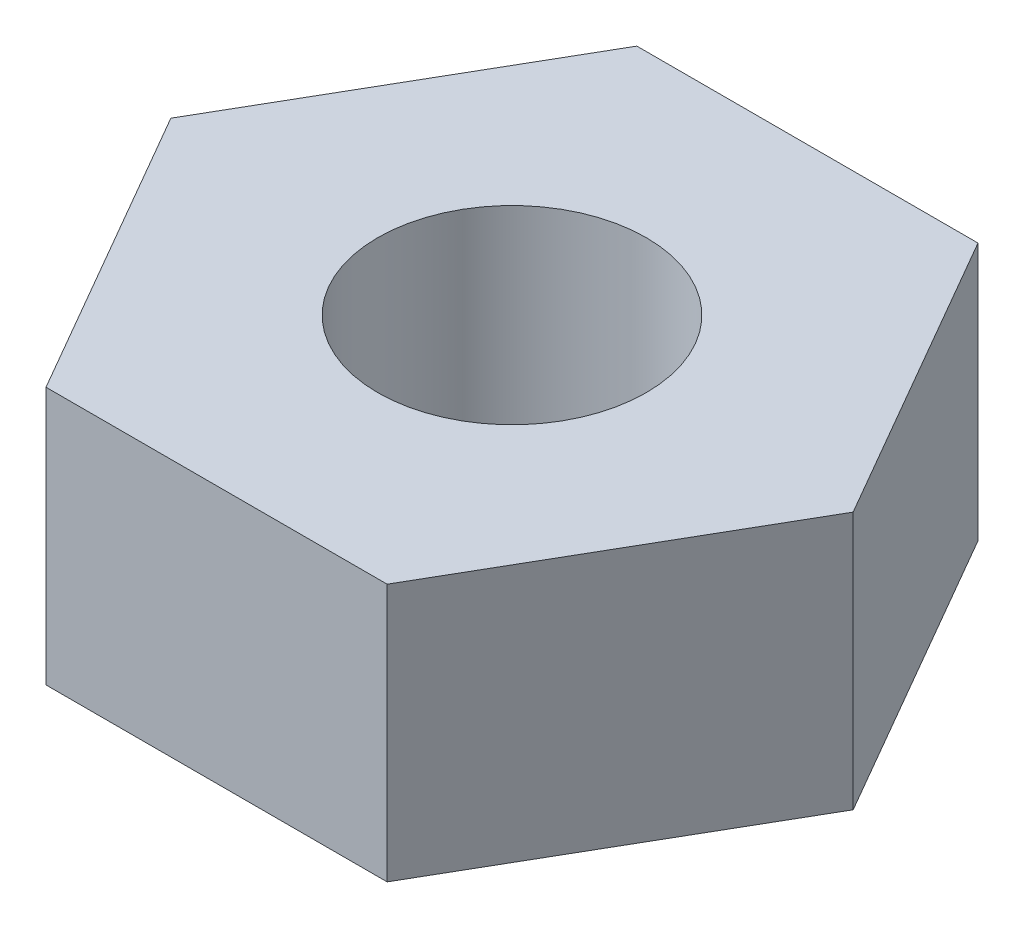
ISO-10303-21;
HEADER;
FILE_DESCRIPTION(('STEP AP214'),'2;1');
FILE_NAME('part.step','',(''),(''),'','','');
FILE_SCHEMA(('AUTOMOTIVE_DESIGN { 1 0 10303 214 1 1 1 1 }'));
ENDSEC;
DATA;
#1=APPLICATION_CONTEXT('core data for automotive mechanical design processes');
#2=APPLICATION_PROTOCOL_DEFINITION('international standard','automotive_design',2000,#1);
#3=PRODUCT_CONTEXT('',#1,'mechanical');
#4=PRODUCT('Part','Part','',(#3));
#5=PRODUCT_RELATED_PRODUCT_CATEGORY('part','',(#4));
#6=PRODUCT_DEFINITION_FORMATION('','',#4);
#7=PRODUCT_DEFINITION_CONTEXT('part definition',#1,'design');
#8=PRODUCT_DEFINITION('design','',#6,#7);
#9=PRODUCT_DEFINITION_SHAPE('','',#8);
#10=(LENGTH_UNIT() NAMED_UNIT(*) SI_UNIT(.MILLI.,.METRE.));
#11=(NAMED_UNIT(*) PLANE_ANGLE_UNIT() SI_UNIT($,.RADIAN.));
#12=(NAMED_UNIT(*) SI_UNIT($,.STERADIAN.) SOLID_ANGLE_UNIT());
#13=UNCERTAINTY_MEASURE_WITH_UNIT(LENGTH_MEASURE(1.E-05),#10,'distance_accuracy_value','');
#14=(GEOMETRIC_REPRESENTATION_CONTEXT(3) GLOBAL_UNCERTAINTY_ASSIGNED_CONTEXT((#13)) GLOBAL_UNIT_ASSIGNED_CONTEXT((#10,
#11,#12)) REPRESENTATION_CONTEXT('',''));
#15=CARTESIAN_POINT('',(0.,0.,0.));
#16=DIRECTION('',(0.,0.,1.));
#17=DIRECTION('',(1.,0.,0.));
#18=AXIS2_PLACEMENT_3D('',#15,#16,#17);
#19=CARTESIAN_POINT('',(-1.5877132402715,2.4,-2.74999999999998));
#20=DIRECTION('',(0.866025403784441,0.,0.499999999999995));
#21=DIRECTION('',(0.499999999999995,0.,-0.866025403784442));
#22=AXIS2_PLACEMENT_3D('',#19,#20,#21);
#23=PLANE('',#22);
#24=DIRECTION('',(-0.499999999999995,0.,0.866025403784442));
#25=VECTOR('',#24,1.);
#26=CARTESIAN_POINT('',(-1.5877132402715,0.,-2.74999999999998));
#27=LINE('',#26,#25);
#28=CARTESIAN_POINT('',(-1.5877132402715,0.,-2.74999999999998));
#29=VERTEX_POINT('',#28);
#30=CARTESIAN_POINT('',(-3.17542648054294,0.,0.));
#31=VERTEX_POINT('',#30);
#32=EDGE_CURVE('E122',#29,#31,#27,.T.);
#33=ORIENTED_EDGE('',*,*,#32,.T.);
#34=DIRECTION('',(0.,-1.,0.));
#35=VECTOR('',#34,1.);
#36=CARTESIAN_POINT('',(-3.17542648054294,2.4,0.));
#37=LINE('',#36,#35);
#38=CARTESIAN_POINT('',(-3.17542648054294,2.4,0.));
#39=VERTEX_POINT('',#38);
#40=EDGE_CURVE('E11',#39,#31,#37,.T.);
#41=ORIENTED_EDGE('',*,*,#40,.F.);
#42=DIRECTION('',(-0.499999999999995,0.,0.866025403784442));
#43=VECTOR('',#42,1.);
#44=CARTESIAN_POINT('',(-1.5877132402715,2.4,-2.74999999999998));
#45=LINE('',#44,#43);
#46=CARTESIAN_POINT('',(-1.5877132402715,2.4,-2.74999999999998));
#47=VERTEX_POINT('',#46);
#48=EDGE_CURVE('E133',#47,#39,#45,.T.);
#49=ORIENTED_EDGE('',*,*,#48,.F.);
#50=DIRECTION('',(0.,-1.,0.));
#51=VECTOR('',#50,1.);
#52=CARTESIAN_POINT('',(-1.5877132402715,2.4,-2.74999999999998));
#53=LINE('',#52,#51);
#54=EDGE_CURVE('E118',#47,#29,#53,.T.);
#55=ORIENTED_EDGE('',*,*,#54,.T.);
#56=EDGE_LOOP('',(#33,#41,#49,#55));
#57=FACE_BOUND('',#56,.T.);
#58=ADVANCED_FACE('F38',(#57),#23,.F.);
#59=CARTESIAN_POINT('',(-3.17542648054294,2.4,0.));
#60=DIRECTION('',(0.866025403784438,0.,-0.500000000000001));
#61=DIRECTION('',(-0.500000000000001,0.,-0.866025403784438));
#62=AXIS2_PLACEMENT_3D('',#59,#60,#61);
#63=PLANE('',#62);
#64=DIRECTION('',(0.500000000000001,0.,0.866025403784438));
#65=VECTOR('',#64,1.);
#66=CARTESIAN_POINT('',(-3.17542648054294,0.,0.));
#67=LINE('',#66,#65);
#68=CARTESIAN_POINT('',(-1.58771324027146,0.,2.75));
#69=VERTEX_POINT('',#68);
#70=EDGE_CURVE('E125',#31,#69,#67,.T.);
#71=ORIENTED_EDGE('',*,*,#70,.T.);
#72=DIRECTION('',(0.,-1.,0.));
#73=VECTOR('',#72,1.);
#74=CARTESIAN_POINT('',(-1.58771324027146,2.4,2.75));
#75=LINE('',#74,#73);
#76=CARTESIAN_POINT('',(-1.58771324027146,2.4,2.75));
#77=VERTEX_POINT('',#76);
#78=EDGE_CURVE('E46',#77,#69,#75,.T.);
#79=ORIENTED_EDGE('',*,*,#78,.F.);
#80=DIRECTION('',(0.500000000000001,0.,0.866025403784438));
#81=VECTOR('',#80,1.);
#82=CARTESIAN_POINT('',(-3.17542648054294,2.4,0.));
#83=LINE('',#82,#81);
#84=EDGE_CURVE('E91',#39,#77,#83,.T.);
#85=ORIENTED_EDGE('',*,*,#84,.F.);
#86=ORIENTED_EDGE('',*,*,#40,.T.);
#87=EDGE_LOOP('',(#71,#79,#85,#86));
#88=FACE_BOUND('',#87,.T.);
#89=ADVANCED_FACE('F158',(#88),#63,.F.);
#90=CARTESIAN_POINT('',(-1.58771324027146,2.4,2.75));
#91=DIRECTION('',(0.,0.,-1.));
#92=DIRECTION('',(-1.,0.,0.));
#93=AXIS2_PLACEMENT_3D('',#90,#91,#92);
#94=PLANE('',#93);
#95=DIRECTION('',(1.,0.,0.));
#96=VECTOR('',#95,1.);
#97=CARTESIAN_POINT('',(-1.58771324027146,0.,2.75));
#98=LINE('',#97,#96);
#99=CARTESIAN_POINT('',(1.58771324027148,0.,2.74999999999999));
#100=VERTEX_POINT('',#99);
#101=EDGE_CURVE('E128',#69,#100,#98,.T.);
#102=ORIENTED_EDGE('',*,*,#101,.T.);
#103=DIRECTION('',(0.,-1.,0.));
#104=VECTOR('',#103,1.);
#105=CARTESIAN_POINT('',(1.58771324027148,2.4,2.74999999999999));
#106=LINE('',#105,#104);
#107=CARTESIAN_POINT('',(1.58771324027148,2.4,2.74999999999999));
#108=VERTEX_POINT('',#107);
#109=EDGE_CURVE('E113',#108,#100,#106,.T.);
#110=ORIENTED_EDGE('',*,*,#109,.F.);
#111=DIRECTION('',(1.,0.,0.));
#112=VECTOR('',#111,1.);
#113=CARTESIAN_POINT('',(-1.58771324027146,2.4,2.75));
#114=LINE('',#113,#112);
#115=EDGE_CURVE('E104',#77,#108,#114,.T.);
#116=ORIENTED_EDGE('',*,*,#115,.F.);
#117=ORIENTED_EDGE('',*,*,#78,.T.);
#118=EDGE_LOOP('',(#102,#110,#116,#117));
#119=FACE_BOUND('',#118,.T.);
#120=ADVANCED_FACE('F139',(#119),#94,.F.);
#121=CARTESIAN_POINT('',(1.58771324027148,2.4,2.74999999999999));
#122=DIRECTION('',(-0.866025403784441,0.,-0.499999999999995));
#123=DIRECTION('',(-0.499999999999995,0.,0.866025403784442));
#124=AXIS2_PLACEMENT_3D('',#121,#122,#123);
#125=PLANE('',#124);
#126=DIRECTION('',(0.499999999999995,0.,-0.866025403784442));
#127=VECTOR('',#126,1.);
#128=CARTESIAN_POINT('',(1.58771324027148,0.,2.74999999999999));
#129=LINE('',#128,#127);
#130=CARTESIAN_POINT('',(3.17542648054294,0.,0.));
#131=VERTEX_POINT('',#130);
#132=EDGE_CURVE('E112',#100,#131,#129,.T.);
#133=ORIENTED_EDGE('',*,*,#132,.T.);
#134=DIRECTION('',(0.,-1.,0.));
#135=VECTOR('',#134,1.);
#136=CARTESIAN_POINT('',(3.17542648054294,2.4,0.));
#137=LINE('',#136,#135);
#138=CARTESIAN_POINT('',(3.17542648054294,2.4,0.));
#139=VERTEX_POINT('',#138);
#140=EDGE_CURVE('E109',#139,#131,#137,.T.);
#141=ORIENTED_EDGE('',*,*,#140,.F.);
#142=DIRECTION('',(0.499999999999995,0.,-0.866025403784442));
#143=VECTOR('',#142,1.);
#144=CARTESIAN_POINT('',(1.58771324027148,2.4,2.74999999999999));
#145=LINE('',#144,#143);
#146=EDGE_CURVE('E98',#108,#139,#145,.T.);
#147=ORIENTED_EDGE('',*,*,#146,.F.);
#148=ORIENTED_EDGE('',*,*,#109,.T.);
#149=EDGE_LOOP('',(#133,#141,#147,#148));
#150=FACE_BOUND('',#149,.T.);
#151=ADVANCED_FACE('F110',(#150),#125,.F.);
#152=CARTESIAN_POINT('',(3.17542648054294,2.4,0.));
#153=DIRECTION('',(-0.866025403784435,0.,0.500000000000007));
#154=DIRECTION('',(0.500000000000007,0.,0.866025403784435));
#155=AXIS2_PLACEMENT_3D('',#152,#153,#154);
#156=PLANE('',#155);
#157=DIRECTION('',(-0.500000000000007,0.,-0.866025403784435));
#158=VECTOR('',#157,1.);
#159=CARTESIAN_POINT('',(3.17542648054294,0.,0.));
#160=LINE('',#159,#158);
#161=CARTESIAN_POINT('',(1.58771324027145,0.,-2.75000000000001));
#162=VERTEX_POINT('',#161);
#163=EDGE_CURVE('E77',#131,#162,#160,.T.);
#164=ORIENTED_EDGE('',*,*,#163,.T.);
#165=DIRECTION('',(0.,-1.,0.));
#166=VECTOR('',#165,1.);
#167=CARTESIAN_POINT('',(1.58771324027145,2.4,-2.75000000000001));
#168=LINE('',#167,#166);
#169=CARTESIAN_POINT('',(1.58771324027145,2.4,-2.75000000000001));
#170=VERTEX_POINT('',#169);
#171=EDGE_CURVE('E114',#170,#162,#168,.T.);
#172=ORIENTED_EDGE('',*,*,#171,.F.);
#173=DIRECTION('',(-0.500000000000007,0.,-0.866025403784435));
#174=VECTOR('',#173,1.);
#175=CARTESIAN_POINT('',(3.17542648054294,2.4,0.));
#176=LINE('',#175,#174);
#177=EDGE_CURVE('E102',#139,#170,#176,.T.);
#178=ORIENTED_EDGE('',*,*,#177,.F.);
#179=ORIENTED_EDGE('',*,*,#140,.T.);
#180=EDGE_LOOP('',(#164,#172,#178,#179));
#181=FACE_BOUND('',#180,.T.);
#182=ADVANCED_FACE('F116',(#181),#156,.F.);
#183=CARTESIAN_POINT('',(1.58771324027145,2.4,-2.75000000000001));
#184=DIRECTION('',(0.,0.,1.));
#185=DIRECTION('',(1.,0.,0.));
#186=AXIS2_PLACEMENT_3D('',#183,#184,#185);
#187=PLANE('',#186);
#188=DIRECTION('',(-1.,0.,0.));
#189=VECTOR('',#188,1.);
#190=CARTESIAN_POINT('',(1.58771324027145,0.,-2.75000000000001));
#191=LINE('',#190,#189);
#192=EDGE_CURVE('E83',#162,#29,#191,.T.);
#193=ORIENTED_EDGE('',*,*,#192,.T.);
#194=ORIENTED_EDGE('',*,*,#54,.F.);
#195=DIRECTION('',(-1.,0.,0.));
#196=VECTOR('',#195,1.);
#197=CARTESIAN_POINT('',(1.58771324027145,2.4,-2.75000000000001));
#198=LINE('',#197,#196);
#199=EDGE_CURVE('E54',#170,#47,#198,.T.);
#200=ORIENTED_EDGE('',*,*,#199,.F.);
#201=ORIENTED_EDGE('',*,*,#171,.T.);
#202=EDGE_LOOP('',(#193,#194,#200,#201));
#203=FACE_BOUND('',#202,.T.);
#204=ADVANCED_FACE('F146',(#203),#187,.F.);
#205=CARTESIAN_POINT('',(0.,2.4,0.));
#206=DIRECTION('',(0.,1.,0.));
#207=DIRECTION('',(0.,0.,1.));
#208=AXIS2_PLACEMENT_3D('',#205,#206,#207);
#209=PLANE('',#208);
#210=CARTESIAN_POINT('',(0.,2.4,0.));
#211=DIRECTION('',(0.,1.,0.));
#212=DIRECTION('',(0.,0.,1.));
#213=AXIS2_PLACEMENT_3D('',#210,#211,#212);
#214=CIRCLE('',#213,1.25);
#215=CARTESIAN_POINT('',(0.,2.4,1.25));
#216=VERTEX_POINT('',#215);
#217=EDGE_CURVE('E215',#216,#216,#214,.T.);
#218=ORIENTED_EDGE('',*,*,#217,.F.);
#219=EDGE_LOOP('',(#218));
#220=FACE_BOUND('',#219,.T.);
#221=ORIENTED_EDGE('',*,*,#48,.T.);
#222=ORIENTED_EDGE('',*,*,#84,.T.);
#223=ORIENTED_EDGE('',*,*,#115,.T.);
#224=ORIENTED_EDGE('',*,*,#146,.T.);
#225=ORIENTED_EDGE('',*,*,#177,.T.);
#226=ORIENTED_EDGE('',*,*,#199,.T.);
#227=EDGE_LOOP('',(#221,#222,#223,#224,#225,#226));
#228=FACE_BOUND('',#227,.T.);
#229=ADVANCED_FACE('F100',(#220,#228),#209,.T.);
#230=CARTESIAN_POINT('',(0.,0.,0.));
#231=DIRECTION('',(0.,1.,0.));
#232=DIRECTION('',(0.,0.,1.));
#233=AXIS2_PLACEMENT_3D('',#230,#231,#232);
#234=PLANE('',#233);
#235=CARTESIAN_POINT('',(0.,0.,0.));
#236=DIRECTION('',(0.,1.,0.));
#237=DIRECTION('',(0.,0.,1.));
#238=AXIS2_PLACEMENT_3D('',#235,#236,#237);
#239=CIRCLE('',#238,1.25);
#240=CARTESIAN_POINT('',(0.,0.,1.25));
#241=VERTEX_POINT('',#240);
#242=EDGE_CURVE('E126',#241,#241,#239,.T.);
#243=ORIENTED_EDGE('',*,*,#242,.T.);
#244=EDGE_LOOP('',(#243));
#245=FACE_BOUND('',#244,.T.);
#246=ORIENTED_EDGE('',*,*,#32,.F.);
#247=ORIENTED_EDGE('',*,*,#192,.F.);
#248=ORIENTED_EDGE('',*,*,#163,.F.);
#249=ORIENTED_EDGE('',*,*,#132,.F.);
#250=ORIENTED_EDGE('',*,*,#101,.F.);
#251=ORIENTED_EDGE('',*,*,#70,.F.);
#252=EDGE_LOOP('',(#246,#247,#248,#249,#250,#251));
#253=FACE_BOUND('',#252,.T.);
#254=ADVANCED_FACE('F142',(#245,#253),#234,.F.);
#255=CARTESIAN_POINT('',(0.,0.,0.));
#256=DIRECTION('',(0.,1.,0.));
#257=DIRECTION('',(0.,0.,1.));
#258=AXIS2_PLACEMENT_3D('',#255,#256,#257);
#259=CYLINDRICAL_SURFACE('',#258,1.25);
#260=ORIENTED_EDGE('',*,*,#242,.F.);
#261=EDGE_LOOP('',(#260));
#262=FACE_BOUND('',#261,.T.);
#263=ORIENTED_EDGE('',*,*,#217,.T.);
#264=EDGE_LOOP('',(#263));
#265=FACE_BOUND('',#264,.T.);
#266=ADVANCED_FACE('F195',(#262,#265),#259,.F.);
#267=CLOSED_SHELL('',(#58,#89,#120,#151,#182,#204,#229,#254,#266));
#268=MANIFOLD_SOLID_BREP('B2',#267);
#269=ADVANCED_BREP_SHAPE_REPRESENTATION('',(#18,#268),#14);
#270=SHAPE_DEFINITION_REPRESENTATION(#9,#269);
ENDSEC;
END-ISO-10303-21;
